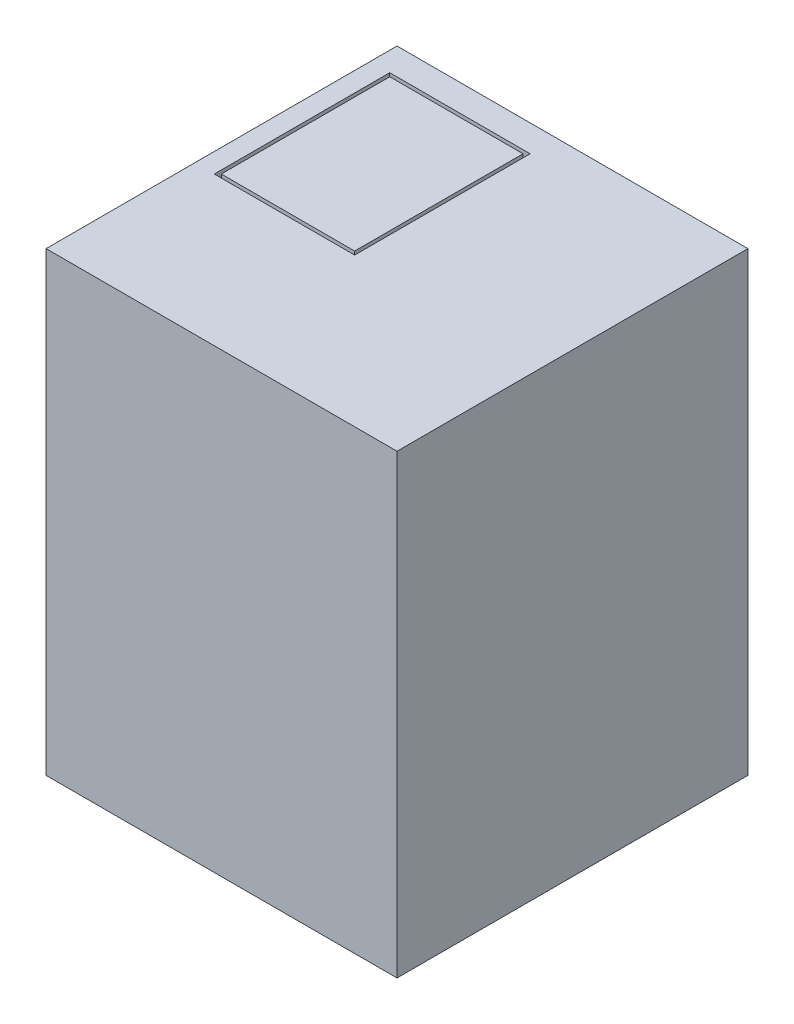
ISO-10303-21;
HEADER;
FILE_DESCRIPTION(('STEP AP214'),'2;1');
FILE_NAME('part.step','',(''),(''),'','','');
FILE_SCHEMA(('AUTOMOTIVE_DESIGN { 1 0 10303 214 1 1 1 1 }'));
ENDSEC;
DATA;
#1=APPLICATION_CONTEXT('core data for automotive mechanical design processes');
#2=APPLICATION_PROTOCOL_DEFINITION('international standard','automotive_design',2000,#1);
#3=PRODUCT_CONTEXT('',#1,'mechanical');
#4=PRODUCT('Part','Part','',(#3));
#5=PRODUCT_RELATED_PRODUCT_CATEGORY('part','',(#4));
#6=PRODUCT_DEFINITION_FORMATION('','',#4);
#7=PRODUCT_DEFINITION_CONTEXT('part definition',#1,'design');
#8=PRODUCT_DEFINITION('design','',#6,#7);
#9=PRODUCT_DEFINITION_SHAPE('','',#8);
#10=(LENGTH_UNIT() NAMED_UNIT(*) SI_UNIT(.MILLI.,.METRE.));
#11=(NAMED_UNIT(*) PLANE_ANGLE_UNIT() SI_UNIT($,.RADIAN.));
#12=(NAMED_UNIT(*) SI_UNIT($,.STERADIAN.) SOLID_ANGLE_UNIT());
#13=UNCERTAINTY_MEASURE_WITH_UNIT(LENGTH_MEASURE(1.E-05),#10,'distance_accuracy_value','');
#14=(GEOMETRIC_REPRESENTATION_CONTEXT(3) GLOBAL_UNCERTAINTY_ASSIGNED_CONTEXT((#13)) GLOBAL_UNIT_ASSIGNED_CONTEXT((#10,
#11,#12)) REPRESENTATION_CONTEXT('',''));
#15=CARTESIAN_POINT('',(0.,0.,0.));
#16=DIRECTION('',(0.,0.,1.));
#17=DIRECTION('',(1.,0.,0.));
#18=AXIS2_PLACEMENT_3D('',#15,#16,#17);
#19=CARTESIAN_POINT('',(0.,125.,0.));
#20=DIRECTION('',(0.,1.,0.));
#21=DIRECTION('',(0.,0.,1.));
#22=AXIS2_PLACEMENT_3D('',#19,#20,#21);
#23=PLANE('',#22);
#24=DIRECTION('',(0.,0.,1.));
#25=VECTOR('',#24,1.);
#26=CARTESIAN_POINT('',(-44.4395922299314,125.,-42.3703109725725));
#27=LINE('',#26,#25);
#28=CARTESIAN_POINT('',(-44.4395922299314,125.,-42.3703109725725));
#29=VERTEX_POINT('',#28);
#30=CARTESIAN_POINT('',(-44.4395922299314,125.,7.62968902742754));
#31=VERTEX_POINT('',#30);
#32=EDGE_CURVE('E171',#29,#31,#27,.T.);
#33=ORIENTED_EDGE('',*,*,#32,.T.);
#34=DIRECTION('',(1.,0.,0.));
#35=VECTOR('',#34,1.);
#36=CARTESIAN_POINT('',(-44.4395922299314,125.,7.62968902742754));
#37=LINE('',#36,#35);
#38=CARTESIAN_POINT('',(-4.43959222993139,125.,7.62968902742754));
#39=VERTEX_POINT('',#38);
#40=EDGE_CURVE('E175',#31,#39,#37,.T.);
#41=ORIENTED_EDGE('',*,*,#40,.T.);
#42=DIRECTION('',(0.,0.,-1.));
#43=VECTOR('',#42,1.);
#44=CARTESIAN_POINT('',(-4.4395922299314,125.,-42.3703109725725));
#45=LINE('',#44,#43);
#46=CARTESIAN_POINT('',(-4.4395922299314,125.,-42.3703109725725));
#47=VERTEX_POINT('',#46);
#48=EDGE_CURVE('E180',#39,#47,#45,.T.);
#49=ORIENTED_EDGE('',*,*,#48,.T.);
#50=DIRECTION('',(-1.,0.,0.));
#51=VECTOR('',#50,1.);
#52=CARTESIAN_POINT('',(-44.4395922299314,125.,-42.3703109725725));
#53=LINE('',#52,#51);
#54=EDGE_CURVE('E184',#47,#29,#53,.T.);
#55=ORIENTED_EDGE('',*,*,#54,.T.);
#56=EDGE_LOOP('',(#33,#41,#49,#55));
#57=FACE_BOUND('',#56,.T.);
#58=DIRECTION('',(1.,0.,0.));
#59=VECTOR('',#58,1.);
#60=CARTESIAN_POINT('',(-43.4395922299314,125.,6.62968902742754));
#61=LINE('',#60,#59);
#62=CARTESIAN_POINT('',(-43.4395922299314,125.,6.62968902742754));
#63=VERTEX_POINT('',#62);
#64=CARTESIAN_POINT('',(-5.43959222993139,125.,6.62968902742754));
#65=VERTEX_POINT('',#64);
#66=EDGE_CURVE('E477',#63,#65,#61,.T.);
#67=ORIENTED_EDGE('',*,*,#66,.F.);
#68=DIRECTION('',(0.,0.,1.));
#69=VECTOR('',#68,1.);
#70=CARTESIAN_POINT('',(-43.4395922299314,125.,-41.3703109725725));
#71=LINE('',#70,#69);
#72=CARTESIAN_POINT('',(-43.4395922299314,125.,-41.3703109725725));
#73=VERTEX_POINT('',#72);
#74=EDGE_CURVE('E160',#73,#63,#71,.T.);
#75=ORIENTED_EDGE('',*,*,#74,.F.);
#76=DIRECTION('',(-1.,0.,0.));
#77=VECTOR('',#76,1.);
#78=CARTESIAN_POINT('',(-43.4395922299314,125.,-41.3703109725725));
#79=LINE('',#78,#77);
#80=CARTESIAN_POINT('',(-5.43959222993139,125.,-41.3703109725725));
#81=VERTEX_POINT('',#80);
#82=EDGE_CURVE('E156',#81,#73,#79,.T.);
#83=ORIENTED_EDGE('',*,*,#82,.F.);
#84=DIRECTION('',(0.,0.,-1.));
#85=VECTOR('',#84,1.);
#86=CARTESIAN_POINT('',(-5.43959222993139,125.,-41.3703109725725));
#87=LINE('',#86,#85);
#88=EDGE_CURVE('E473',#65,#81,#87,.T.);
#89=ORIENTED_EDGE('',*,*,#88,.F.);
#90=EDGE_LOOP('',(#67,#75,#83,#89));
#91=FACE_BOUND('',#90,.T.);
#92=ADVANCED_FACE('F45',(#57,#91),#23,.T.);
#93=CARTESIAN_POINT('',(50.,130.,-50.));
#94=DIRECTION('',(-1.,0.,0.));
#95=DIRECTION('',(0.,0.,1.));
#96=AXIS2_PLACEMENT_3D('',#93,#94,#95);
#97=PLANE('',#96);
#98=DIRECTION('',(0.,0.,-1.));
#99=VECTOR('',#98,1.);
#100=CARTESIAN_POINT('',(50.,0.,-50.));
#101=LINE('',#100,#99);
#102=CARTESIAN_POINT('',(50.,0.,50.));
#103=VERTEX_POINT('',#102);
#104=CARTESIAN_POINT('',(50.,0.,-50.));
#105=VERTEX_POINT('',#104);
#106=EDGE_CURVE('E202',#103,#105,#101,.T.);
#107=ORIENTED_EDGE('',*,*,#106,.T.);
#108=DIRECTION('',(0.,-1.,0.));
#109=VECTOR('',#108,1.);
#110=CARTESIAN_POINT('',(50.,130.,-50.));
#111=LINE('',#110,#109);
#112=CARTESIAN_POINT('',(50.,130.,-50.));
#113=VERTEX_POINT('',#112);
#114=EDGE_CURVE('E11',#113,#105,#111,.T.);
#115=ORIENTED_EDGE('',*,*,#114,.F.);
#116=DIRECTION('',(0.,0.,-1.));
#117=VECTOR('',#116,1.);
#118=CARTESIAN_POINT('',(50.,130.,-50.));
#119=LINE('',#118,#117);
#120=CARTESIAN_POINT('',(50.,130.,50.));
#121=VERTEX_POINT('',#120);
#122=EDGE_CURVE('E211',#121,#113,#119,.T.);
#123=ORIENTED_EDGE('',*,*,#122,.F.);
#124=DIRECTION('',(0.,-1.,0.));
#125=VECTOR('',#124,1.);
#126=CARTESIAN_POINT('',(50.,130.,50.));
#127=LINE('',#126,#125);
#128=EDGE_CURVE('E225',#121,#103,#127,.T.);
#129=ORIENTED_EDGE('',*,*,#128,.T.);
#130=EDGE_LOOP('',(#107,#115,#123,#129));
#131=FACE_BOUND('',#130,.T.);
#132=ADVANCED_FACE('F47',(#131),#97,.F.);
#133=CARTESIAN_POINT('',(-50.,130.,-50.));
#134=DIRECTION('',(0.,0.,1.));
#135=DIRECTION('',(1.,0.,0.));
#136=AXIS2_PLACEMENT_3D('',#133,#134,#135);
#137=PLANE('',#136);
#138=DIRECTION('',(-1.,0.,0.));
#139=VECTOR('',#138,1.);
#140=CARTESIAN_POINT('',(-50.,0.,-50.));
#141=LINE('',#140,#139);
#142=CARTESIAN_POINT('',(-50.,0.,-50.));
#143=VERTEX_POINT('',#142);
#144=EDGE_CURVE('E229',#105,#143,#141,.T.);
#145=ORIENTED_EDGE('',*,*,#144,.T.);
#146=DIRECTION('',(0.,-1.,0.));
#147=VECTOR('',#146,1.);
#148=CARTESIAN_POINT('',(-50.,130.,-50.));
#149=LINE('',#148,#147);
#150=CARTESIAN_POINT('',(-50.,130.,-50.));
#151=VERTEX_POINT('',#150);
#152=EDGE_CURVE('E54',#151,#143,#149,.T.);
#153=ORIENTED_EDGE('',*,*,#152,.F.);
#154=DIRECTION('',(-1.,0.,0.));
#155=VECTOR('',#154,1.);
#156=CARTESIAN_POINT('',(-50.,130.,-50.));
#157=LINE('',#156,#155);
#158=EDGE_CURVE('E215',#113,#151,#157,.T.);
#159=ORIENTED_EDGE('',*,*,#158,.F.);
#160=ORIENTED_EDGE('',*,*,#114,.T.);
#161=EDGE_LOOP('',(#145,#153,#159,#160));
#162=FACE_BOUND('',#161,.T.);
#163=ADVANCED_FACE('F265',(#162),#137,.F.);
#164=CARTESIAN_POINT('',(-50.,130.,-50.));
#165=DIRECTION('',(1.,0.,0.));
#166=DIRECTION('',(0.,0.,-1.));
#167=AXIS2_PLACEMENT_3D('',#164,#165,#166);
#168=PLANE('',#167);
#169=DIRECTION('',(0.,0.,1.));
#170=VECTOR('',#169,1.);
#171=CARTESIAN_POINT('',(-50.,0.,-50.));
#172=LINE('',#171,#170);
#173=CARTESIAN_POINT('',(-50.,0.,50.));
#174=VERTEX_POINT('',#173);
#175=EDGE_CURVE('E232',#143,#174,#172,.T.);
#176=ORIENTED_EDGE('',*,*,#175,.T.);
#177=DIRECTION('',(0.,-1.,0.));
#178=VECTOR('',#177,1.);
#179=CARTESIAN_POINT('',(-50.,130.,50.));
#180=LINE('',#179,#178);
#181=CARTESIAN_POINT('',(-50.,130.,50.));
#182=VERTEX_POINT('',#181);
#183=EDGE_CURVE('E240',#182,#174,#180,.T.);
#184=ORIENTED_EDGE('',*,*,#183,.F.);
#185=DIRECTION('',(0.,0.,1.));
#186=VECTOR('',#185,1.);
#187=CARTESIAN_POINT('',(-50.,130.,-50.));
#188=LINE('',#187,#186);
#189=EDGE_CURVE('E219',#151,#182,#188,.T.);
#190=ORIENTED_EDGE('',*,*,#189,.F.);
#191=ORIENTED_EDGE('',*,*,#152,.T.);
#192=EDGE_LOOP('',(#176,#184,#190,#191));
#193=FACE_BOUND('',#192,.T.);
#194=ADVANCED_FACE('F249',(#193),#168,.F.);
#195=CARTESIAN_POINT('',(-50.,130.,50.));
#196=DIRECTION('',(0.,0.,-1.));
#197=DIRECTION('',(-1.,0.,0.));
#198=AXIS2_PLACEMENT_3D('',#195,#196,#197);
#199=PLANE('',#198);
#200=DIRECTION('',(1.,0.,0.));
#201=VECTOR('',#200,1.);
#202=CARTESIAN_POINT('',(-50.,0.,50.));
#203=LINE('',#202,#201);
#204=EDGE_CURVE('E216',#174,#103,#203,.T.);
#205=ORIENTED_EDGE('',*,*,#204,.T.);
#206=ORIENTED_EDGE('',*,*,#128,.F.);
#207=DIRECTION('',(1.,0.,0.));
#208=VECTOR('',#207,1.);
#209=CARTESIAN_POINT('',(-50.,130.,50.));
#210=LINE('',#209,#208);
#211=EDGE_CURVE('E222',#182,#121,#210,.T.);
#212=ORIENTED_EDGE('',*,*,#211,.F.);
#213=ORIENTED_EDGE('',*,*,#183,.T.);
#214=EDGE_LOOP('',(#205,#206,#212,#213));
#215=FACE_BOUND('',#214,.T.);
#216=ADVANCED_FACE('F258',(#215),#199,.F.);
#217=CARTESIAN_POINT('',(0.,130.,0.));
#218=DIRECTION('',(0.,1.,0.));
#219=DIRECTION('',(0.,0.,1.));
#220=AXIS2_PLACEMENT_3D('',#217,#218,#219);
#221=PLANE('',#220);
#222=DIRECTION('',(0.,0.,1.));
#223=VECTOR('',#222,1.);
#224=CARTESIAN_POINT('',(-44.4395922299314,130.,-42.3703109725725));
#225=LINE('',#224,#223);
#226=CARTESIAN_POINT('',(-44.4395922299314,130.,-42.3703109725725));
#227=VERTEX_POINT('',#226);
#228=CARTESIAN_POINT('',(-44.4395922299314,130.,7.62968902742754));
#229=VERTEX_POINT('',#228);
#230=EDGE_CURVE('E69',#227,#229,#225,.T.);
#231=ORIENTED_EDGE('',*,*,#230,.F.);
#232=DIRECTION('',(-1.,0.,0.));
#233=VECTOR('',#232,1.);
#234=CARTESIAN_POINT('',(-44.4395922299314,130.,-42.3703109725725));
#235=LINE('',#234,#233);
#236=CARTESIAN_POINT('',(-4.4395922299314,130.,-42.3703109725725));
#237=VERTEX_POINT('',#236);
#238=EDGE_CURVE('E176',#237,#227,#235,.T.);
#239=ORIENTED_EDGE('',*,*,#238,.F.);
#240=DIRECTION('',(0.,0.,-1.));
#241=VECTOR('',#240,1.);
#242=CARTESIAN_POINT('',(-4.4395922299314,130.,-42.3703109725725));
#243=LINE('',#242,#241);
#244=CARTESIAN_POINT('',(-4.43959222993139,130.,7.62968902742754));
#245=VERTEX_POINT('',#244);
#246=EDGE_CURVE('E192',#245,#237,#243,.T.);
#247=ORIENTED_EDGE('',*,*,#246,.F.);
#248=DIRECTION('',(1.,0.,0.));
#249=VECTOR('',#248,1.);
#250=CARTESIAN_POINT('',(-44.4395922299314,130.,7.62968902742754));
#251=LINE('',#250,#249);
#252=EDGE_CURVE('E166',#229,#245,#251,.T.);
#253=ORIENTED_EDGE('',*,*,#252,.F.);
#254=EDGE_LOOP('',(#231,#239,#247,#253));
#255=FACE_BOUND('',#254,.T.);
#256=ORIENTED_EDGE('',*,*,#122,.T.);
#257=ORIENTED_EDGE('',*,*,#158,.T.);
#258=ORIENTED_EDGE('',*,*,#189,.T.);
#259=ORIENTED_EDGE('',*,*,#211,.T.);
#260=EDGE_LOOP('',(#256,#257,#258,#259));
#261=FACE_BOUND('',#260,.T.);
#262=ADVANCED_FACE('F264',(#255,#261),#221,.T.);
#263=CARTESIAN_POINT('',(0.,0.,0.));
#264=DIRECTION('',(0.,1.,0.));
#265=DIRECTION('',(0.,0.,1.));
#266=AXIS2_PLACEMENT_3D('',#263,#264,#265);
#267=PLANE('',#266);
#268=ORIENTED_EDGE('',*,*,#106,.F.);
#269=ORIENTED_EDGE('',*,*,#204,.F.);
#270=ORIENTED_EDGE('',*,*,#175,.F.);
#271=ORIENTED_EDGE('',*,*,#144,.F.);
#272=EDGE_LOOP('',(#268,#269,#270,#271));
#273=FACE_BOUND('',#272,.T.);
#274=ADVANCED_FACE('F255',(#273),#267,.F.);
#275=CARTESIAN_POINT('',(-44.4395922299314,125.,-42.3703109725725));
#276=DIRECTION('',(-1.,0.,0.));
#277=DIRECTION('',(0.,0.,1.));
#278=AXIS2_PLACEMENT_3D('',#275,#276,#277);
#279=PLANE('',#278);
#280=ORIENTED_EDGE('',*,*,#230,.T.);
#281=DIRECTION('',(0.,1.,0.));
#282=VECTOR('',#281,1.);
#283=CARTESIAN_POINT('',(-44.4395922299314,125.,7.62968902742754));
#284=LINE('',#283,#282);
#285=EDGE_CURVE('E187',#31,#229,#284,.T.);
#286=ORIENTED_EDGE('',*,*,#285,.F.);
#287=ORIENTED_EDGE('',*,*,#32,.F.);
#288=DIRECTION('',(0.,1.,0.));
#289=VECTOR('',#288,1.);
#290=CARTESIAN_POINT('',(-44.4395922299314,125.,-42.3703109725725));
#291=LINE('',#290,#289);
#292=EDGE_CURVE('E199',#29,#227,#291,.T.);
#293=ORIENTED_EDGE('',*,*,#292,.T.);
#294=EDGE_LOOP('',(#280,#286,#287,#293));
#295=FACE_BOUND('',#294,.T.);
#296=ADVANCED_FACE('F285',(#295),#279,.F.);
#297=CARTESIAN_POINT('',(-44.4395922299314,125.,-42.3703109725725));
#298=DIRECTION('',(0.,0.,-1.));
#299=DIRECTION('',(-1.,0.,0.));
#300=AXIS2_PLACEMENT_3D('',#297,#298,#299);
#301=PLANE('',#300);
#302=ORIENTED_EDGE('',*,*,#238,.T.);
#303=ORIENTED_EDGE('',*,*,#292,.F.);
#304=ORIENTED_EDGE('',*,*,#54,.F.);
#305=DIRECTION('',(0.,1.,0.));
#306=VECTOR('',#305,1.);
#307=CARTESIAN_POINT('',(-4.4395922299314,125.,-42.3703109725725));
#308=LINE('',#307,#306);
#309=EDGE_CURVE('E203',#47,#237,#308,.T.);
#310=ORIENTED_EDGE('',*,*,#309,.T.);
#311=EDGE_LOOP('',(#302,#303,#304,#310));
#312=FACE_BOUND('',#311,.T.);
#313=ADVANCED_FACE('F281',(#312),#301,.F.);
#314=CARTESIAN_POINT('',(-4.4395922299314,125.,-42.3703109725725));
#315=DIRECTION('',(1.,0.,0.));
#316=DIRECTION('',(0.,0.,-1.));
#317=AXIS2_PLACEMENT_3D('',#314,#315,#316);
#318=PLANE('',#317);
#319=ORIENTED_EDGE('',*,*,#246,.T.);
#320=ORIENTED_EDGE('',*,*,#309,.F.);
#321=ORIENTED_EDGE('',*,*,#48,.F.);
#322=DIRECTION('',(0.,1.,0.));
#323=VECTOR('',#322,1.);
#324=CARTESIAN_POINT('',(-4.43959222993139,125.,7.62968902742754));
#325=LINE('',#324,#323);
#326=EDGE_CURVE('E206',#39,#245,#325,.T.);
#327=ORIENTED_EDGE('',*,*,#326,.T.);
#328=EDGE_LOOP('',(#319,#320,#321,#327));
#329=FACE_BOUND('',#328,.T.);
#330=ADVANCED_FACE('F284',(#329),#318,.F.);
#331=CARTESIAN_POINT('',(-44.4395922299314,125.,7.62968902742754));
#332=DIRECTION('',(0.,0.,1.));
#333=DIRECTION('',(1.,0.,0.));
#334=AXIS2_PLACEMENT_3D('',#331,#332,#333);
#335=PLANE('',#334);
#336=ORIENTED_EDGE('',*,*,#252,.T.);
#337=ORIENTED_EDGE('',*,*,#326,.F.);
#338=ORIENTED_EDGE('',*,*,#40,.F.);
#339=ORIENTED_EDGE('',*,*,#285,.T.);
#340=EDGE_LOOP('',(#336,#337,#338,#339));
#341=FACE_BOUND('',#340,.T.);
#342=ADVANCED_FACE('F289',(#341),#335,.F.);
#343=CARTESIAN_POINT('',(-43.4395922299314,130.,-41.3703109725725));
#344=DIRECTION('',(1.,0.,0.));
#345=DIRECTION('',(0.,0.,-1.));
#346=AXIS2_PLACEMENT_3D('',#343,#344,#345);
#347=PLANE('',#346);
#348=ORIENTED_EDGE('',*,*,#74,.T.);
#349=DIRECTION('',(0.,-1.,0.));
#350=VECTOR('',#349,1.);
#351=CARTESIAN_POINT('',(-43.4395922299314,130.,6.62968902742754));
#352=LINE('',#351,#350);
#353=CARTESIAN_POINT('',(-43.4395922299314,130.,6.62968902742754));
#354=VERTEX_POINT('',#353);
#355=EDGE_CURVE('E139',#354,#63,#352,.T.);
#356=ORIENTED_EDGE('',*,*,#355,.F.);
#357=DIRECTION('',(0.,0.,1.));
#358=VECTOR('',#357,1.);
#359=CARTESIAN_POINT('',(-43.4395922299314,130.,-41.3703109725725));
#360=LINE('',#359,#358);
#361=CARTESIAN_POINT('',(-43.4395922299314,130.,-41.3703109725725));
#362=VERTEX_POINT('',#361);
#363=EDGE_CURVE('E147',#362,#354,#360,.T.);
#364=ORIENTED_EDGE('',*,*,#363,.F.);
#365=DIRECTION('',(0.,-1.,0.));
#366=VECTOR('',#365,1.);
#367=CARTESIAN_POINT('',(-43.4395922299314,130.,-41.3703109725725));
#368=LINE('',#367,#366);
#369=EDGE_CURVE('E470',#362,#73,#368,.T.);
#370=ORIENTED_EDGE('',*,*,#369,.T.);
#371=EDGE_LOOP('',(#348,#356,#364,#370));
#372=FACE_BOUND('',#371,.T.);
#373=ADVANCED_FACE('F158',(#372),#347,.F.);
#374=CARTESIAN_POINT('',(-43.4395922299314,130.,6.62968902742754));
#375=DIRECTION('',(0.,0.,-1.));
#376=DIRECTION('',(-1.,0.,0.));
#377=AXIS2_PLACEMENT_3D('',#374,#375,#376);
#378=PLANE('',#377);
#379=ORIENTED_EDGE('',*,*,#66,.T.);
#380=DIRECTION('',(0.,-1.,0.));
#381=VECTOR('',#380,1.);
#382=CARTESIAN_POINT('',(-5.43959222993139,130.,6.62968902742754));
#383=LINE('',#382,#381);
#384=CARTESIAN_POINT('',(-5.43959222993139,130.,6.62968902742754));
#385=VERTEX_POINT('',#384);
#386=EDGE_CURVE('E142',#385,#65,#383,.T.);
#387=ORIENTED_EDGE('',*,*,#386,.F.);
#388=DIRECTION('',(1.,0.,0.));
#389=VECTOR('',#388,1.);
#390=CARTESIAN_POINT('',(-43.4395922299314,130.,6.62968902742754));
#391=LINE('',#390,#389);
#392=EDGE_CURVE('E135',#354,#385,#391,.T.);
#393=ORIENTED_EDGE('',*,*,#392,.F.);
#394=ORIENTED_EDGE('',*,*,#355,.T.);
#395=EDGE_LOOP('',(#379,#387,#393,#394));
#396=FACE_BOUND('',#395,.T.);
#397=ADVANCED_FACE('F137',(#396),#378,.F.);
#398=CARTESIAN_POINT('',(-5.43959222993139,130.,-41.3703109725725));
#399=DIRECTION('',(-1.,0.,0.));
#400=DIRECTION('',(0.,0.,1.));
#401=AXIS2_PLACEMENT_3D('',#398,#399,#400);
#402=PLANE('',#401);
#403=ORIENTED_EDGE('',*,*,#88,.T.);
#404=DIRECTION('',(0.,-1.,0.));
#405=VECTOR('',#404,1.);
#406=CARTESIAN_POINT('',(-5.43959222993139,130.,-41.3703109725725));
#407=LINE('',#406,#405);
#408=CARTESIAN_POINT('',(-5.43959222993139,130.,-41.3703109725725));
#409=VERTEX_POINT('',#408);
#410=EDGE_CURVE('E61',#409,#81,#407,.T.);
#411=ORIENTED_EDGE('',*,*,#410,.F.);
#412=DIRECTION('',(0.,0.,-1.));
#413=VECTOR('',#412,1.);
#414=CARTESIAN_POINT('',(-5.43959222993139,130.,-41.3703109725725));
#415=LINE('',#414,#413);
#416=EDGE_CURVE('E146',#385,#409,#415,.T.);
#417=ORIENTED_EDGE('',*,*,#416,.F.);
#418=ORIENTED_EDGE('',*,*,#386,.T.);
#419=EDGE_LOOP('',(#403,#411,#417,#418));
#420=FACE_BOUND('',#419,.T.);
#421=ADVANCED_FACE('F341',(#420),#402,.F.);
#422=CARTESIAN_POINT('',(-43.4395922299314,130.,-41.3703109725725));
#423=DIRECTION('',(0.,0.,1.));
#424=DIRECTION('',(1.,0.,0.));
#425=AXIS2_PLACEMENT_3D('',#422,#423,#424);
#426=PLANE('',#425);
#427=ORIENTED_EDGE('',*,*,#82,.T.);
#428=ORIENTED_EDGE('',*,*,#369,.F.);
#429=DIRECTION('',(-1.,0.,0.));
#430=VECTOR('',#429,1.);
#431=CARTESIAN_POINT('',(-43.4395922299314,130.,-41.3703109725725));
#432=LINE('',#431,#430);
#433=EDGE_CURVE('E151',#409,#362,#432,.T.);
#434=ORIENTED_EDGE('',*,*,#433,.F.);
#435=ORIENTED_EDGE('',*,*,#410,.T.);
#436=EDGE_LOOP('',(#427,#428,#434,#435));
#437=FACE_BOUND('',#436,.T.);
#438=ADVANCED_FACE('F347',(#437),#426,.F.);
#439=CARTESIAN_POINT('',(0.,130.,0.));
#440=DIRECTION('',(0.,1.,0.));
#441=DIRECTION('',(0.,0.,1.));
#442=AXIS2_PLACEMENT_3D('',#439,#440,#441);
#443=PLANE('',#442);
#444=ORIENTED_EDGE('',*,*,#363,.T.);
#445=ORIENTED_EDGE('',*,*,#392,.T.);
#446=ORIENTED_EDGE('',*,*,#416,.T.);
#447=ORIENTED_EDGE('',*,*,#433,.T.);
#448=EDGE_LOOP('',(#444,#445,#446,#447));
#449=FACE_BOUND('',#448,.T.);
#450=ADVANCED_FACE('F150',(#449),#443,.T.);
#451=CLOSED_SHELL('',(#92,#132,#163,#194,#216,#262,#274,#296,#313,#330,#342,#373,#397,#421,#438,#450));
#452=MANIFOLD_SOLID_BREP('B2',#451);
#453=ADVANCED_BREP_SHAPE_REPRESENTATION('',(#18,#452),#14);
#454=SHAPE_DEFINITION_REPRESENTATION(#9,#453);
ENDSEC;
END-ISO-10303-21;
